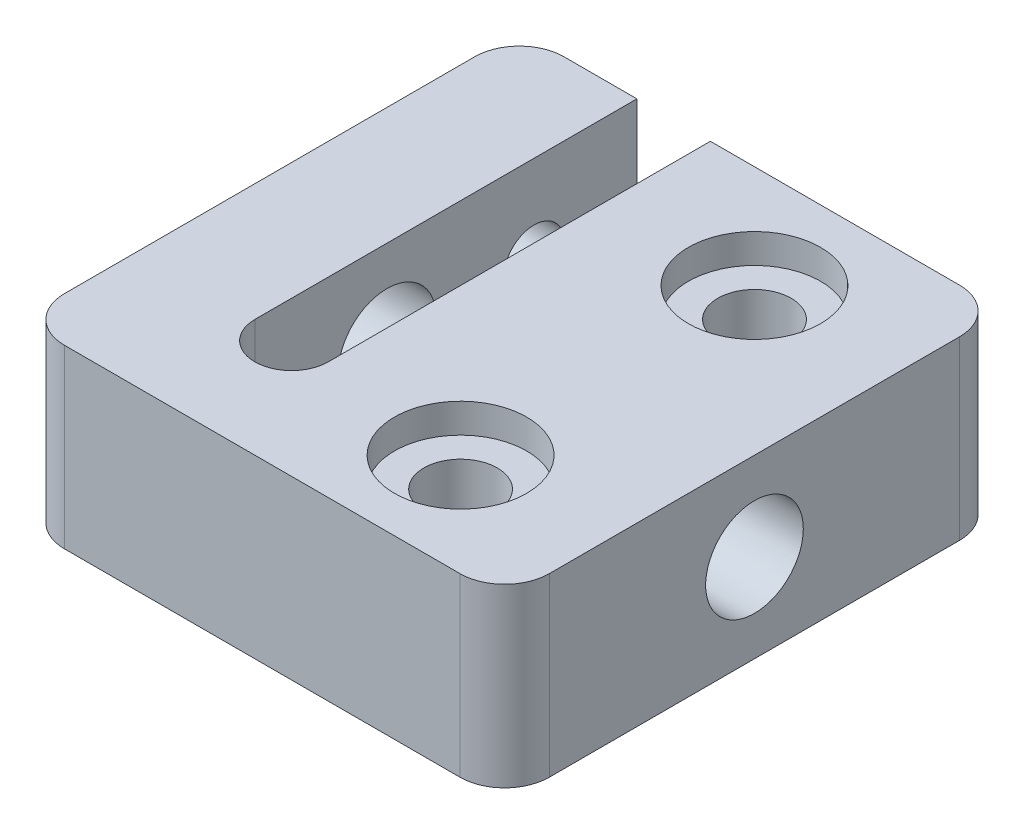
ISO-10303-21;
HEADER;
FILE_DESCRIPTION(('STEP AP214'),'2;1');
FILE_NAME('part.step','',(''),(''),'','','');
FILE_SCHEMA(('AUTOMOTIVE_DESIGN { 1 0 10303 214 1 1 1 1 }'));
ENDSEC;
DATA;
#1=APPLICATION_CONTEXT('core data for automotive mechanical design processes');
#2=APPLICATION_PROTOCOL_DEFINITION('international standard','automotive_design',2000,#1);
#3=PRODUCT_CONTEXT('',#1,'mechanical');
#4=PRODUCT('Part','Part','',(#3));
#5=PRODUCT_RELATED_PRODUCT_CATEGORY('part','',(#4));
#6=PRODUCT_DEFINITION_FORMATION('','',#4);
#7=PRODUCT_DEFINITION_CONTEXT('part definition',#1,'design');
#8=PRODUCT_DEFINITION('design','',#6,#7);
#9=PRODUCT_DEFINITION_SHAPE('','',#8);
#10=(LENGTH_UNIT() NAMED_UNIT(*) SI_UNIT(.MILLI.,.METRE.));
#11=(NAMED_UNIT(*) PLANE_ANGLE_UNIT() SI_UNIT($,.RADIAN.));
#12=(NAMED_UNIT(*) SI_UNIT($,.STERADIAN.) SOLID_ANGLE_UNIT());
#13=UNCERTAINTY_MEASURE_WITH_UNIT(LENGTH_MEASURE(1.E-05),#10,'distance_accuracy_value','');
#14=(GEOMETRIC_REPRESENTATION_CONTEXT(3) GLOBAL_UNCERTAINTY_ASSIGNED_CONTEXT((#13)) GLOBAL_UNIT_ASSIGNED_CONTEXT((#10,
#11,#12)) REPRESENTATION_CONTEXT('',''));
#15=CARTESIAN_POINT('',(0.,0.,0.));
#16=DIRECTION('',(0.,0.,1.));
#17=DIRECTION('',(1.,0.,0.));
#18=AXIS2_PLACEMENT_3D('',#15,#16,#17);
#19=CARTESIAN_POINT('',(8.80940107675852,0.,6.));
#20=DIRECTION('',(0.,0.,-1.));
#21=DIRECTION('',(-1.,0.,0.));
#22=AXIS2_PLACEMENT_3D('',#19,#20,#21);
#23=PLANE('',#22);
#24=DIRECTION('',(-1.,0.,0.));
#25=VECTOR('',#24,1.);
#26=CARTESIAN_POINT('',(3.50772533671816,0.,6.));
#27=LINE('',#26,#25);
#28=CARTESIAN_POINT('',(8.80940107675852,0.,6.));
#29=VERTEX_POINT('',#28);
#30=CARTESIAN_POINT('',(4.19059892324151,0.,6.));
#31=VERTEX_POINT('',#30);
#32=EDGE_CURVE('E35',#29,#31,#27,.T.);
#33=ORIENTED_EDGE('',*,*,#32,.F.);
#34=DIRECTION('',(0.,1.,0.));
#35=VECTOR('',#34,1.);
#36=CARTESIAN_POINT('',(8.80940107675852,0.,6.));
#37=LINE('',#36,#35);
#38=CARTESIAN_POINT('',(8.80940107675852,5.,6.));
#39=VERTEX_POINT('',#38);
#40=EDGE_CURVE('E11',#29,#39,#37,.T.);
#41=ORIENTED_EDGE('',*,*,#40,.T.);
#42=DIRECTION('',(-1.,0.,0.));
#43=VECTOR('',#42,1.);
#44=CARTESIAN_POINT('',(8.80940107675852,5.,6.));
#45=LINE('',#44,#43);
#46=CARTESIAN_POINT('',(4.19059892324151,5.,6.));
#47=VERTEX_POINT('',#46);
#48=EDGE_CURVE('E27',#39,#47,#45,.T.);
#49=ORIENTED_EDGE('',*,*,#48,.T.);
#50=DIRECTION('',(0.,1.,0.));
#51=VECTOR('',#50,1.);
#52=CARTESIAN_POINT('',(4.19059892324151,0.,6.));
#53=LINE('',#52,#51);
#54=EDGE_CURVE('E270',#31,#47,#53,.T.);
#55=ORIENTED_EDGE('',*,*,#54,.F.);
#56=EDGE_LOOP('',(#33,#41,#49,#55));
#57=FACE_BOUND('',#56,.T.);
#58=ADVANCED_FACE('F16',(#57),#23,.F.);
#59=CARTESIAN_POINT('',(11.118802153517,0.,10.));
#60=DIRECTION('',(0.866025403784439,0.,-0.5));
#61=DIRECTION('',(-0.5,0.,-0.866025403784439));
#62=AXIS2_PLACEMENT_3D('',#59,#60,#61);
#63=PLANE('',#62);
#64=DIRECTION('',(-0.5,0.,-0.866025403784439));
#65=VECTOR('',#64,1.);
#66=CARTESIAN_POINT('',(7.26546224611227,0.,3.32581950154222));
#67=LINE('',#66,#65);
#68=CARTESIAN_POINT('',(11.118802153517,0.,10.));
#69=VERTEX_POINT('',#68);
#70=EDGE_CURVE('E280',#69,#29,#67,.T.);
#71=ORIENTED_EDGE('',*,*,#70,.F.);
#72=DIRECTION('',(0.,1.,0.));
#73=VECTOR('',#72,1.);
#74=CARTESIAN_POINT('',(11.118802153517,0.,10.));
#75=LINE('',#74,#73);
#76=CARTESIAN_POINT('',(11.118802153517,5.,10.));
#77=VERTEX_POINT('',#76);
#78=EDGE_CURVE('E276',#69,#77,#75,.T.);
#79=ORIENTED_EDGE('',*,*,#78,.T.);
#80=DIRECTION('',(-0.5,0.,-0.866025403784439));
#81=VECTOR('',#80,1.);
#82=CARTESIAN_POINT('',(11.118802153517,5.,10.));
#83=LINE('',#82,#81);
#84=EDGE_CURVE('E272',#77,#39,#83,.T.);
#85=ORIENTED_EDGE('',*,*,#84,.T.);
#86=ORIENTED_EDGE('',*,*,#40,.F.);
#87=EDGE_LOOP('',(#71,#79,#85,#86));
#88=FACE_BOUND('',#87,.T.);
#89=ADVANCED_FACE('F1075',(#88),#63,.F.);
#90=CARTESIAN_POINT('',(8.80940107675851,0.,14.));
#91=DIRECTION('',(0.866025403784438,0.,0.5));
#92=DIRECTION('',(0.5,0.,-0.866025403784438));
#93=AXIS2_PLACEMENT_3D('',#90,#91,#92);
#94=PLANE('',#93);
#95=DIRECTION('',(0.5,0.,-0.866025403784438));
#96=VECTOR('',#95,1.);
#97=CARTESIAN_POINT('',(10.5892533833327,0.,10.9172053750448));
#98=LINE('',#97,#96);
#99=CARTESIAN_POINT('',(8.80940107675851,0.,14.));
#100=VERTEX_POINT('',#99);
#101=EDGE_CURVE('E284',#100,#69,#98,.T.);
#102=ORIENTED_EDGE('',*,*,#101,.F.);
#103=DIRECTION('',(0.,1.,0.));
#104=VECTOR('',#103,1.);
#105=CARTESIAN_POINT('',(8.80940107675851,0.,14.));
#106=LINE('',#105,#104);
#107=CARTESIAN_POINT('',(8.80940107675851,5.,14.));
#108=VERTEX_POINT('',#107);
#109=EDGE_CURVE('E163',#100,#108,#106,.T.);
#110=ORIENTED_EDGE('',*,*,#109,.T.);
#111=DIRECTION('',(0.5,0.,-0.866025403784438));
#112=VECTOR('',#111,1.);
#113=CARTESIAN_POINT('',(8.80940107675851,5.,14.));
#114=LINE('',#113,#112);
#115=EDGE_CURVE('E159',#108,#77,#114,.T.);
#116=ORIENTED_EDGE('',*,*,#115,.T.);
#117=ORIENTED_EDGE('',*,*,#78,.F.);
#118=EDGE_LOOP('',(#102,#110,#116,#117));
#119=FACE_BOUND('',#118,.T.);
#120=ADVANCED_FACE('F1064',(#119),#94,.F.);
#121=CARTESIAN_POINT('',(4.19059892324151,0.,14.));
#122=DIRECTION('',(0.,0.,1.));
#123=DIRECTION('',(1.,0.,0.));
#124=AXIS2_PLACEMENT_3D('',#121,#122,#123);
#125=PLANE('',#124);
#126=DIRECTION('',(1.,0.,0.));
#127=VECTOR('',#126,1.);
#128=CARTESIAN_POINT('',(1.19832425995964,0.,14.));
#129=LINE('',#128,#127);
#130=CARTESIAN_POINT('',(4.19059892324151,0.,14.));
#131=VERTEX_POINT('',#130);
#132=EDGE_CURVE('E348',#131,#100,#129,.T.);
#133=ORIENTED_EDGE('',*,*,#132,.F.);
#134=DIRECTION('',(0.,1.,0.));
#135=VECTOR('',#134,1.);
#136=CARTESIAN_POINT('',(4.19059892324151,0.,14.));
#137=LINE('',#136,#135);
#138=CARTESIAN_POINT('',(4.19059892324151,5.,14.));
#139=VERTEX_POINT('',#138);
#140=EDGE_CURVE('E164',#131,#139,#137,.T.);
#141=ORIENTED_EDGE('',*,*,#140,.T.);
#142=DIRECTION('',(1.,0.,0.));
#143=VECTOR('',#142,1.);
#144=CARTESIAN_POINT('',(4.19059892324151,5.,14.));
#145=LINE('',#144,#143);
#146=EDGE_CURVE('E264',#139,#108,#145,.T.);
#147=ORIENTED_EDGE('',*,*,#146,.T.);
#148=ORIENTED_EDGE('',*,*,#109,.F.);
#149=EDGE_LOOP('',(#133,#141,#147,#148));
#150=FACE_BOUND('',#149,.T.);
#151=ADVANCED_FACE('F1053',(#150),#125,.F.);
#152=CARTESIAN_POINT('',(1.88119784648301,0.,10.));
#153=DIRECTION('',(-0.866025403784439,0.,0.5));
#154=DIRECTION('',(0.5,0.,0.866025403784439));
#155=AXIS2_PLACEMENT_3D('',#152,#153,#154);
#156=PLANE('',#155);
#157=DIRECTION('',(0.5,0.,0.866025403784439));
#158=VECTOR('',#157,1.);
#159=CARTESIAN_POINT('',(-0.817441522542489,0.,5.32581950154222));
#160=LINE('',#159,#158);
#161=CARTESIAN_POINT('',(1.88119784648301,0.,10.));
#162=VERTEX_POINT('',#161);
#163=EDGE_CURVE('E186',#162,#131,#160,.T.);
#164=ORIENTED_EDGE('',*,*,#163,.F.);
#165=DIRECTION('',(0.,1.,0.));
#166=VECTOR('',#165,1.);
#167=CARTESIAN_POINT('',(1.88119784648301,0.,10.));
#168=LINE('',#167,#166);
#169=CARTESIAN_POINT('',(1.88119784648301,5.,10.));
#170=VERTEX_POINT('',#169);
#171=EDGE_CURVE('E260',#162,#170,#168,.T.);
#172=ORIENTED_EDGE('',*,*,#171,.T.);
#173=DIRECTION('',(0.5,0.,0.866025403784439));
#174=VECTOR('',#173,1.);
#175=CARTESIAN_POINT('',(1.88119784648301,5.,10.));
#176=LINE('',#175,#174);
#177=EDGE_CURVE('E265',#170,#139,#176,.T.);
#178=ORIENTED_EDGE('',*,*,#177,.T.);
#179=ORIENTED_EDGE('',*,*,#140,.F.);
#180=EDGE_LOOP('',(#164,#172,#178,#179));
#181=FACE_BOUND('',#180,.T.);
#182=ADVANCED_FACE('F1042',(#181),#156,.F.);
#183=CARTESIAN_POINT('',(4.19059892324151,0.,6.));
#184=DIRECTION('',(-0.866025403784438,0.,-0.5));
#185=DIRECTION('',(-0.5,0.,0.866025403784438));
#186=AXIS2_PLACEMENT_3D('',#183,#184,#185);
#187=PLANE('',#186);
#188=DIRECTION('',(-0.5,0.,0.866025403784438));
#189=VECTOR('',#188,1.);
#190=CARTESIAN_POINT('',(4.81575069143646,0.,4.91720537504484));
#191=LINE('',#190,#189);
#192=EDGE_CURVE('E182',#31,#162,#191,.T.);
#193=ORIENTED_EDGE('',*,*,#192,.F.);
#194=ORIENTED_EDGE('',*,*,#54,.T.);
#195=DIRECTION('',(-0.5,0.,0.866025403784438));
#196=VECTOR('',#195,1.);
#197=CARTESIAN_POINT('',(4.19059892324151,5.,6.));
#198=LINE('',#197,#196);
#199=EDGE_CURVE('E266',#47,#170,#198,.T.);
#200=ORIENTED_EDGE('',*,*,#199,.T.);
#201=ORIENTED_EDGE('',*,*,#171,.F.);
#202=EDGE_LOOP('',(#193,#194,#200,#201));
#203=FACE_BOUND('',#202,.T.);
#204=ADVANCED_FACE('F1032',(#203),#187,.F.);
#205=CARTESIAN_POINT('',(6.5,5.,10.));
#206=DIRECTION('',(0.,1.,0.));
#207=DIRECTION('',(0.,0.,1.));
#208=AXIS2_PLACEMENT_3D('',#205,#206,#207);
#209=PLANE('',#208);
#210=CARTESIAN_POINT('',(6.5,5.,10.));
#211=DIRECTION('',(0.,-1.,0.));
#212=DIRECTION('',(1.,0.,0.));
#213=AXIS2_PLACEMENT_3D('',#210,#211,#212);
#214=CIRCLE('',#213,2.5);
#215=CARTESIAN_POINT('',(9.,5.,10.));
#216=VERTEX_POINT('',#215);
#217=EDGE_CURVE('E197',#216,#216,#214,.T.);
#218=ORIENTED_EDGE('',*,*,#217,.F.);
#219=EDGE_LOOP('',(#218));
#220=FACE_BOUND('',#219,.T.);
#221=ORIENTED_EDGE('',*,*,#199,.F.);
#222=ORIENTED_EDGE('',*,*,#48,.F.);
#223=ORIENTED_EDGE('',*,*,#84,.F.);
#224=ORIENTED_EDGE('',*,*,#115,.F.);
#225=ORIENTED_EDGE('',*,*,#146,.F.);
#226=ORIENTED_EDGE('',*,*,#177,.F.);
#227=EDGE_LOOP('',(#221,#222,#223,#224,#225,#226));
#228=FACE_BOUND('',#227,.T.);
#229=ADVANCED_FACE('F1022',(#220,#228),#209,.F.);
#230=CARTESIAN_POINT('',(4.19059892324151,0.,-6.));
#231=DIRECTION('',(0.,0.,1.));
#232=DIRECTION('',(1.,0.,0.));
#233=AXIS2_PLACEMENT_3D('',#230,#231,#232);
#234=PLANE('',#233);
#235=DIRECTION('',(1.,0.,0.));
#236=VECTOR('',#235,1.);
#237=CARTESIAN_POINT('',(1.19832425995965,0.,-6.));
#238=LINE('',#237,#236);
#239=CARTESIAN_POINT('',(4.19059892324151,0.,-6.));
#240=VERTEX_POINT('',#239);
#241=CARTESIAN_POINT('',(8.80940107675851,0.,-6.));
#242=VERTEX_POINT('',#241);
#243=EDGE_CURVE('E285',#240,#242,#238,.T.);
#244=ORIENTED_EDGE('',*,*,#243,.F.);
#245=DIRECTION('',(0.,1.,0.));
#246=VECTOR('',#245,1.);
#247=CARTESIAN_POINT('',(4.19059892324151,0.,-6.));
#248=LINE('',#247,#246);
#249=CARTESIAN_POINT('',(4.19059892324151,5.,-6.));
#250=VERTEX_POINT('',#249);
#251=EDGE_CURVE('E271',#240,#250,#248,.T.);
#252=ORIENTED_EDGE('',*,*,#251,.T.);
#253=DIRECTION('',(1.,0.,0.));
#254=VECTOR('',#253,1.);
#255=CARTESIAN_POINT('',(4.19059892324151,5.,-6.));
#256=LINE('',#255,#254);
#257=CARTESIAN_POINT('',(8.80940107675851,5.,-6.));
#258=VERTEX_POINT('',#257);
#259=EDGE_CURVE('E233',#250,#258,#256,.T.);
#260=ORIENTED_EDGE('',*,*,#259,.T.);
#261=DIRECTION('',(0.,1.,0.));
#262=VECTOR('',#261,1.);
#263=CARTESIAN_POINT('',(8.80940107675851,0.,-6.));
#264=LINE('',#263,#262);
#265=EDGE_CURVE('E244',#242,#258,#264,.T.);
#266=ORIENTED_EDGE('',*,*,#265,.F.);
#267=EDGE_LOOP('',(#244,#252,#260,#266));
#268=FACE_BOUND('',#267,.T.);
#269=ADVANCED_FACE('F1011',(#268),#234,.F.);
#270=CARTESIAN_POINT('',(1.88119784648301,0.,-10.));
#271=DIRECTION('',(-0.86602540378444,0.,0.5));
#272=DIRECTION('',(0.5,0.,0.86602540378444));
#273=AXIS2_PLACEMENT_3D('',#270,#271,#272);
#274=PLANE('',#273);
#275=DIRECTION('',(0.5,0.,0.86602540378444));
#276=VECTOR('',#275,1.);
#277=CARTESIAN_POINT('',(3.5126854963797,0.,-7.17418049845778));
#278=LINE('',#277,#276);
#279=CARTESIAN_POINT('',(1.88119784648301,0.,-10.));
#280=VERTEX_POINT('',#279);
#281=EDGE_CURVE('E398',#280,#240,#278,.T.);
#282=ORIENTED_EDGE('',*,*,#281,.F.);
#283=DIRECTION('',(0.,1.,0.));
#284=VECTOR('',#283,1.);
#285=CARTESIAN_POINT('',(1.88119784648301,0.,-10.));
#286=LINE('',#285,#284);
#287=CARTESIAN_POINT('',(1.88119784648301,5.,-10.));
#288=VERTEX_POINT('',#287);
#289=EDGE_CURVE('E229',#280,#288,#286,.T.);
#290=ORIENTED_EDGE('',*,*,#289,.T.);
#291=DIRECTION('',(0.5,0.,0.86602540378444));
#292=VECTOR('',#291,1.);
#293=CARTESIAN_POINT('',(1.88119784648301,5.,-10.));
#294=LINE('',#293,#292);
#295=EDGE_CURVE('E203',#288,#250,#294,.T.);
#296=ORIENTED_EDGE('',*,*,#295,.T.);
#297=ORIENTED_EDGE('',*,*,#251,.F.);
#298=EDGE_LOOP('',(#282,#290,#296,#297));
#299=FACE_BOUND('',#298,.T.);
#300=ADVANCED_FACE('F1000',(#299),#274,.F.);
#301=CARTESIAN_POINT('',(4.19059892324152,0.,-14.));
#302=DIRECTION('',(-0.866025403784438,0.,-0.5));
#303=DIRECTION('',(-0.5,0.,0.866025403784438));
#304=AXIS2_PLACEMENT_3D('',#301,#302,#303);
#305=PLANE('',#304);
#306=DIRECTION('',(-0.5,0.,0.866025403784438));
#307=VECTOR('',#306,1.);
#308=CARTESIAN_POINT('',(0.485623672514256,0.,-7.58279462495518));
#309=LINE('',#308,#307);
#310=CARTESIAN_POINT('',(4.19059892324152,0.,-14.));
#311=VERTEX_POINT('',#310);
#312=EDGE_CURVE('E259',#311,#280,#309,.T.);
#313=ORIENTED_EDGE('',*,*,#312,.F.);
#314=DIRECTION('',(0.,1.,0.));
#315=VECTOR('',#314,1.);
#316=CARTESIAN_POINT('',(4.19059892324152,0.,-14.));
#317=LINE('',#316,#315);
#318=CARTESIAN_POINT('',(4.19059892324152,5.,-14.));
#319=VERTEX_POINT('',#318);
#320=EDGE_CURVE('E199',#311,#319,#317,.T.);
#321=ORIENTED_EDGE('',*,*,#320,.T.);
#322=DIRECTION('',(-0.5,0.,0.866025403784438));
#323=VECTOR('',#322,1.);
#324=CARTESIAN_POINT('',(4.19059892324152,5.,-14.));
#325=LINE('',#324,#323);
#326=EDGE_CURVE('E204',#319,#288,#325,.T.);
#327=ORIENTED_EDGE('',*,*,#326,.T.);
#328=ORIENTED_EDGE('',*,*,#289,.F.);
#329=EDGE_LOOP('',(#313,#321,#327,#328));
#330=FACE_BOUND('',#329,.T.);
#331=ADVANCED_FACE('F989',(#330),#305,.F.);
#332=CARTESIAN_POINT('',(8.80940107675852,0.,-14.));
#333=DIRECTION('',(0.,0.,-1.));
#334=DIRECTION('',(-1.,0.,0.));
#335=AXIS2_PLACEMENT_3D('',#332,#333,#334);
#336=PLANE('',#335);
#337=DIRECTION('',(-1.,0.,0.));
#338=VECTOR('',#337,1.);
#339=CARTESIAN_POINT('',(3.50772533671818,0.,-14.));
#340=LINE('',#339,#338);
#341=CARTESIAN_POINT('',(8.80940107675852,0.,-14.));
#342=VERTEX_POINT('',#341);
#343=EDGE_CURVE('E181',#342,#311,#340,.T.);
#344=ORIENTED_EDGE('',*,*,#343,.F.);
#345=DIRECTION('',(0.,1.,0.));
#346=VECTOR('',#345,1.);
#347=CARTESIAN_POINT('',(8.80940107675852,0.,-14.));
#348=LINE('',#347,#346);
#349=CARTESIAN_POINT('',(8.80940107675852,5.,-14.));
#350=VERTEX_POINT('',#349);
#351=EDGE_CURVE('E20',#342,#350,#348,.T.);
#352=ORIENTED_EDGE('',*,*,#351,.T.);
#353=DIRECTION('',(-1.,0.,0.));
#354=VECTOR('',#353,1.);
#355=CARTESIAN_POINT('',(8.80940107675852,5.,-14.));
#356=LINE('',#355,#354);
#357=EDGE_CURVE('E375',#350,#319,#356,.T.);
#358=ORIENTED_EDGE('',*,*,#357,.T.);
#359=ORIENTED_EDGE('',*,*,#320,.F.);
#360=EDGE_LOOP('',(#344,#352,#358,#359));
#361=FACE_BOUND('',#360,.T.);
#362=ADVANCED_FACE('F977',(#361),#336,.F.);
#363=CARTESIAN_POINT('',(11.118802153517,0.,-10.));
#364=DIRECTION('',(0.86602540378444,0.,-0.5));
#365=DIRECTION('',(-0.5,0.,-0.86602540378444));
#366=AXIS2_PLACEMENT_3D('',#363,#364,#365);
#367=PLANE('',#366);
#368=DIRECTION('',(-0.5,0.,-0.86602540378444));
#369=VECTOR('',#368,1.);
#370=CARTESIAN_POINT('',(11.5955892650345,0.,-9.17418049845776));
#371=LINE('',#370,#369);
#372=CARTESIAN_POINT('',(11.118802153517,0.,-10.));
#373=VERTEX_POINT('',#372);
#374=EDGE_CURVE('E176',#373,#342,#371,.T.);
#375=ORIENTED_EDGE('',*,*,#374,.F.);
#376=DIRECTION('',(0.,1.,0.));
#377=VECTOR('',#376,1.);
#378=CARTESIAN_POINT('',(11.118802153517,0.,-10.));
#379=LINE('',#378,#377);
#380=CARTESIAN_POINT('',(11.118802153517,5.,-10.));
#381=VERTEX_POINT('',#380);
#382=EDGE_CURVE('E243',#373,#381,#379,.T.);
#383=ORIENTED_EDGE('',*,*,#382,.T.);
#384=DIRECTION('',(-0.5,0.,-0.86602540378444));
#385=VECTOR('',#384,1.);
#386=CARTESIAN_POINT('',(11.118802153517,5.,-10.));
#387=LINE('',#386,#385);
#388=EDGE_CURVE('E239',#381,#350,#387,.T.);
#389=ORIENTED_EDGE('',*,*,#388,.T.);
#390=ORIENTED_EDGE('',*,*,#351,.F.);
#391=EDGE_LOOP('',(#375,#383,#389,#390));
#392=FACE_BOUND('',#391,.T.);
#393=ADVANCED_FACE('F967',(#392),#367,.F.);
#394=CARTESIAN_POINT('',(8.80940107675851,0.,-6.));
#395=DIRECTION('',(0.866025403784438,0.,0.5));
#396=DIRECTION('',(0.5,0.,-0.866025403784438));
#397=AXIS2_PLACEMENT_3D('',#394,#395,#396);
#398=PLANE('',#397);
#399=DIRECTION('',(0.5,0.,-0.866025403784438));
#400=VECTOR('',#399,1.);
#401=CARTESIAN_POINT('',(6.2591263644105,0.,-1.58279462495516));
#402=LINE('',#401,#400);
#403=EDGE_CURVE('E180',#242,#373,#402,.T.);
#404=ORIENTED_EDGE('',*,*,#403,.F.);
#405=ORIENTED_EDGE('',*,*,#265,.T.);
#406=DIRECTION('',(0.5,0.,-0.866025403784438));
#407=VECTOR('',#406,1.);
#408=CARTESIAN_POINT('',(8.80940107675851,5.,-6.));
#409=LINE('',#408,#407);
#410=EDGE_CURVE('E131',#258,#381,#409,.T.);
#411=ORIENTED_EDGE('',*,*,#410,.T.);
#412=ORIENTED_EDGE('',*,*,#382,.F.);
#413=EDGE_LOOP('',(#404,#405,#411,#412));
#414=FACE_BOUND('',#413,.T.);
#415=ADVANCED_FACE('F18',(#414),#398,.F.);
#416=CARTESIAN_POINT('',(6.5,5.,-10.));
#417=DIRECTION('',(0.,1.,0.));
#418=DIRECTION('',(0.,0.,1.));
#419=AXIS2_PLACEMENT_3D('',#416,#417,#418);
#420=PLANE('',#419);
#421=CARTESIAN_POINT('',(6.5,5.,-10.));
#422=DIRECTION('',(0.,-1.,0.));
#423=DIRECTION('',(1.,0.,0.));
#424=AXIS2_PLACEMENT_3D('',#421,#422,#423);
#425=CIRCLE('',#424,2.5);
#426=CARTESIAN_POINT('',(9.,5.,-10.));
#427=VERTEX_POINT('',#426);
#428=EDGE_CURVE('E124',#427,#427,#425,.T.);
#429=ORIENTED_EDGE('',*,*,#428,.F.);
#430=EDGE_LOOP('',(#429));
#431=FACE_BOUND('',#430,.T.);
#432=ORIENTED_EDGE('',*,*,#410,.F.);
#433=ORIENTED_EDGE('',*,*,#259,.F.);
#434=ORIENTED_EDGE('',*,*,#295,.F.);
#435=ORIENTED_EDGE('',*,*,#326,.F.);
#436=ORIENTED_EDGE('',*,*,#357,.F.);
#437=ORIENTED_EDGE('',*,*,#388,.F.);
#438=EDGE_LOOP('',(#432,#433,#434,#435,#436,#437));
#439=FACE_BOUND('',#438,.T.);
#440=ADVANCED_FACE('F945',(#431,#439),#420,.F.);
#441=CARTESIAN_POINT('',(6.5,12.,-10.));
#442=DIRECTION('',(0.,1.,0.));
#443=DIRECTION('',(-1.,0.,0.));
#444=AXIS2_PLACEMENT_3D('',#441,#442,#443);
#445=CYLINDRICAL_SURFACE('',#444,4.5);
#446=CARTESIAN_POINT('',(6.5,10.,-10.));
#447=DIRECTION('',(0.,-1.,0.));
#448=DIRECTION('',(-1.,0.,0.));
#449=AXIS2_PLACEMENT_3D('',#446,#447,#448);
#450=CIRCLE('',#449,4.5);
#451=CARTESIAN_POINT('',(11.,10.,-10.));
#452=VERTEX_POINT('',#451);
#453=EDGE_CURVE('E123',#452,#452,#450,.T.);
#454=ORIENTED_EDGE('',*,*,#453,.T.);
#455=EDGE_LOOP('',(#454));
#456=FACE_BOUND('',#455,.T.);
#457=CARTESIAN_POINT('',(6.5,12.,-10.));
#458=DIRECTION('',(0.,-1.,0.));
#459=DIRECTION('',(-1.,0.,0.));
#460=AXIS2_PLACEMENT_3D('',#457,#458,#459);
#461=CIRCLE('',#460,4.5);
#462=CARTESIAN_POINT('',(11.,12.,-10.));
#463=VERTEX_POINT('',#462);
#464=EDGE_CURVE('E237',#463,#463,#461,.T.);
#465=ORIENTED_EDGE('',*,*,#464,.F.);
#466=EDGE_LOOP('',(#465));
#467=FACE_BOUND('',#466,.T.);
#468=ADVANCED_FACE('F934',(#456,#467),#445,.F.);
#469=CARTESIAN_POINT('',(6.5,10.,-10.));
#470=DIRECTION('',(0.,-1.,0.));
#471=DIRECTION('',(0.,0.,-1.));
#472=AXIS2_PLACEMENT_3D('',#469,#470,#471);
#473=PLANE('',#472);
#474=CARTESIAN_POINT('',(6.5,10.,-10.));
#475=DIRECTION('',(0.,1.,0.));
#476=DIRECTION('',(1.,0.,0.));
#477=AXIS2_PLACEMENT_3D('',#474,#475,#476);
#478=CIRCLE('',#477,2.5);
#479=CARTESIAN_POINT('',(9.,10.,-10.));
#480=VERTEX_POINT('',#479);
#481=EDGE_CURVE('E135',#480,#480,#478,.T.);
#482=ORIENTED_EDGE('',*,*,#481,.F.);
#483=EDGE_LOOP('',(#482));
#484=FACE_BOUND('',#483,.T.);
#485=ORIENTED_EDGE('',*,*,#453,.F.);
#486=EDGE_LOOP('',(#485));
#487=FACE_BOUND('',#486,.T.);
#488=ADVANCED_FACE('F924',(#484,#487),#473,.F.);
#489=CARTESIAN_POINT('',(6.5,12.,10.));
#490=DIRECTION('',(0.,1.,0.));
#491=DIRECTION('',(-1.,0.,0.));
#492=AXIS2_PLACEMENT_3D('',#489,#490,#491);
#493=CYLINDRICAL_SURFACE('',#492,4.5);
#494=CARTESIAN_POINT('',(6.5,10.,10.));
#495=DIRECTION('',(0.,-1.,0.));
#496=DIRECTION('',(-1.,0.,0.));
#497=AXIS2_PLACEMENT_3D('',#494,#495,#496);
#498=CIRCLE('',#497,4.5);
#499=CARTESIAN_POINT('',(11.,10.,10.));
#500=VERTEX_POINT('',#499);
#501=EDGE_CURVE('E119',#500,#500,#498,.T.);
#502=ORIENTED_EDGE('',*,*,#501,.T.);
#503=EDGE_LOOP('',(#502));
#504=FACE_BOUND('',#503,.T.);
#505=CARTESIAN_POINT('',(6.5,12.,10.));
#506=DIRECTION('',(0.,-1.,0.));
#507=DIRECTION('',(-1.,0.,0.));
#508=AXIS2_PLACEMENT_3D('',#505,#506,#507);
#509=CIRCLE('',#508,4.5);
#510=CARTESIAN_POINT('',(11.,12.,10.));
#511=VERTEX_POINT('',#510);
#512=EDGE_CURVE('E234',#511,#511,#509,.T.);
#513=ORIENTED_EDGE('',*,*,#512,.F.);
#514=EDGE_LOOP('',(#513));
#515=FACE_BOUND('',#514,.T.);
#516=ADVANCED_FACE('F912',(#504,#515),#493,.F.);
#517=CARTESIAN_POINT('',(6.5,10.,10.));
#518=DIRECTION('',(0.,-1.,0.));
#519=DIRECTION('',(0.,0.,-1.));
#520=AXIS2_PLACEMENT_3D('',#517,#518,#519);
#521=PLANE('',#520);
#522=CARTESIAN_POINT('',(6.5,10.,10.));
#523=DIRECTION('',(0.,1.,0.));
#524=DIRECTION('',(1.,0.,0.));
#525=AXIS2_PLACEMENT_3D('',#522,#523,#524);
#526=CIRCLE('',#525,2.5);
#527=CARTESIAN_POINT('',(9.,10.,10.));
#528=VERTEX_POINT('',#527);
#529=EDGE_CURVE('E193',#528,#528,#526,.T.);
#530=ORIENTED_EDGE('',*,*,#529,.F.);
#531=EDGE_LOOP('',(#530));
#532=FACE_BOUND('',#531,.T.);
#533=ORIENTED_EDGE('',*,*,#501,.F.);
#534=EDGE_LOOP('',(#533));
#535=FACE_BOUND('',#534,.T.);
#536=ADVANCED_FACE('F120',(#532,#535),#521,.F.);
#537=CARTESIAN_POINT('',(-11.5,6.,-10.));
#538=DIRECTION('',(1.,0.,0.));
#539=DIRECTION('',(0.,0.,1.));
#540=AXIS2_PLACEMENT_3D('',#537,#538,#539);
#541=CYLINDRICAL_SURFACE('',#540,2.067);
#542=CARTESIAN_POINT('',(-8.5,6.,-10.));
#543=DIRECTION('',(-1.,0.,0.));
#544=DIRECTION('',(0.,0.,1.));
#545=AXIS2_PLACEMENT_3D('',#542,#543,#544);
#546=CIRCLE('',#545,2.067);
#547=CARTESIAN_POINT('',(-8.5,6.,-12.067));
#548=VERTEX_POINT('',#547);
#549=EDGE_CURVE('E141',#548,#548,#546,.T.);
#550=ORIENTED_EDGE('',*,*,#549,.F.);
#551=EDGE_LOOP('',(#550));
#552=FACE_BOUND('',#551,.T.);
#553=CARTESIAN_POINT('',(-16.5,6.,-10.));
#554=DIRECTION('',(1.,0.,0.));
#555=DIRECTION('',(0.,0.,1.));
#556=AXIS2_PLACEMENT_3D('',#553,#554,#555);
#557=CIRCLE('',#556,2.067);
#558=CARTESIAN_POINT('',(-16.5,6.,-7.933));
#559=VERTEX_POINT('',#558);
#560=EDGE_CURVE('E157',#559,#559,#557,.T.);
#561=ORIENTED_EDGE('',*,*,#560,.F.);
#562=EDGE_LOOP('',(#561));
#563=FACE_BOUND('',#562,.T.);
#564=ADVANCED_FACE('F888',(#552,#563),#541,.F.);
#565=CARTESIAN_POINT('',(3.5,6.,0.));
#566=DIRECTION('',(1.,0.,0.));
#567=DIRECTION('',(0.,0.,1.));
#568=AXIS2_PLACEMENT_3D('',#565,#566,#567);
#569=CYLINDRICAL_SURFACE('',#568,3.3235);
#570=CARTESIAN_POINT('',(-16.5,6.,0.));
#571=DIRECTION('',(1.,0.,0.));
#572=DIRECTION('',(0.,0.,1.));
#573=AXIS2_PLACEMENT_3D('',#570,#571,#572);
#574=CIRCLE('',#573,3.3235);
#575=CARTESIAN_POINT('',(-16.5,6.,3.3235));
#576=VERTEX_POINT('',#575);
#577=EDGE_CURVE('E153',#576,#576,#574,.T.);
#578=ORIENTED_EDGE('',*,*,#577,.F.);
#579=EDGE_LOOP('',(#578));
#580=FACE_BOUND('',#579,.T.);
#581=CARTESIAN_POINT('',(-8.5,6.,0.));
#582=DIRECTION('',(-1.,0.,0.));
#583=DIRECTION('',(0.,0.,1.));
#584=AXIS2_PLACEMENT_3D('',#581,#582,#583);
#585=CIRCLE('',#584,3.3235);
#586=CARTESIAN_POINT('',(-8.5,6.,-3.3235));
#587=VERTEX_POINT('',#586);
#588=EDGE_CURVE('E146',#587,#587,#585,.T.);
#589=ORIENTED_EDGE('',*,*,#588,.F.);
#590=EDGE_LOOP('',(#589));
#591=FACE_BOUND('',#590,.T.);
#592=ADVANCED_FACE('F877',(#580,#591),#569,.F.);
#593=CARTESIAN_POINT('',(3.5,6.,0.));
#594=DIRECTION('',(1.,0.,0.));
#595=DIRECTION('',(0.,0.,1.));
#596=AXIS2_PLACEMENT_3D('',#593,#594,#595);
#597=CYLINDRICAL_SURFACE('',#596,3.3235);
#598=CARTESIAN_POINT('',(-3.5,6.,0.));
#599=DIRECTION('',(1.,0.,0.));
#600=DIRECTION('',(0.,0.,1.));
#601=AXIS2_PLACEMENT_3D('',#598,#599,#600);
#602=CIRCLE('',#601,3.3235);
#603=CARTESIAN_POINT('',(-3.5,6.,-3.3235));
#604=VERTEX_POINT('',#603);
#605=EDGE_CURVE('E251',#604,#604,#602,.T.);
#606=ORIENTED_EDGE('',*,*,#605,.F.);
#607=EDGE_LOOP('',(#606));
#608=FACE_BOUND('',#607,.T.);
#609=CARTESIAN_POINT('',(16.5,6.,0.));
#610=DIRECTION('',(-1.,0.,0.));
#611=DIRECTION('',(0.,0.,1.));
#612=AXIS2_PLACEMENT_3D('',#609,#610,#611);
#613=CIRCLE('',#612,3.3235);
#614=CARTESIAN_POINT('',(16.5,6.,-3.3235));
#615=VERTEX_POINT('',#614);
#616=EDGE_CURVE('E165',#615,#615,#613,.T.);
#617=ORIENTED_EDGE('',*,*,#616,.F.);
#618=EDGE_LOOP('',(#617));
#619=FACE_BOUND('',#618,.T.);
#620=ADVANCED_FACE('F866',(#608,#619),#597,.F.);
#621=CARTESIAN_POINT('',(6.5,0.,-10.));
#622=DIRECTION('',(0.,-1.,0.));
#623=DIRECTION('',(1.,0.,0.));
#624=AXIS2_PLACEMENT_3D('',#621,#622,#623);
#625=CYLINDRICAL_SURFACE('',#624,2.5);
#626=ORIENTED_EDGE('',*,*,#428,.T.);
#627=EDGE_LOOP('',(#626));
#628=FACE_BOUND('',#627,.T.);
#629=ORIENTED_EDGE('',*,*,#481,.T.);
#630=EDGE_LOOP('',(#629));
#631=FACE_BOUND('',#630,.T.);
#632=ADVANCED_FACE('F854',(#628,#631),#625,.F.);
#633=CARTESIAN_POINT('',(6.5,0.,10.));
#634=DIRECTION('',(0.,-1.,0.));
#635=DIRECTION('',(1.,0.,0.));
#636=AXIS2_PLACEMENT_3D('',#633,#634,#635);
#637=CYLINDRICAL_SURFACE('',#636,2.5);
#638=ORIENTED_EDGE('',*,*,#217,.T.);
#639=EDGE_LOOP('',(#638));
#640=FACE_BOUND('',#639,.T.);
#641=ORIENTED_EDGE('',*,*,#529,.T.);
#642=EDGE_LOOP('',(#641));
#643=FACE_BOUND('',#642,.T.);
#644=ADVANCED_FACE('F844',(#640,#643),#637,.F.);
#645=CARTESIAN_POINT('',(-6.,0.,9.));
#646=DIRECTION('',(0.,-1.,0.));
#647=DIRECTION('',(1.,0.,0.));
#648=AXIS2_PLACEMENT_3D('',#645,#646,#647);
#649=CYLINDRICAL_SURFACE('',#648,2.5);
#650=CARTESIAN_POINT('',(-6.,0.,9.));
#651=DIRECTION('',(0.,-1.,0.));
#652=DIRECTION('',(1.,0.,0.));
#653=AXIS2_PLACEMENT_3D('',#650,#651,#652);
#654=CIRCLE('',#653,2.5);
#655=CARTESIAN_POINT('',(-3.5,0.,9.));
#656=VERTEX_POINT('',#655);
#657=CARTESIAN_POINT('',(-8.5,0.,9.));
#658=VERTEX_POINT('',#657);
#659=EDGE_CURVE('E198',#656,#658,#654,.T.);
#660=ORIENTED_EDGE('',*,*,#659,.T.);
#661=DIRECTION('',(0.,1.,0.));
#662=VECTOR('',#661,1.);
#663=CARTESIAN_POINT('',(-8.5,0.,9.));
#664=LINE('',#663,#662);
#665=CARTESIAN_POINT('',(-8.5,12.,9.));
#666=VERTEX_POINT('',#665);
#667=EDGE_CURVE('E139',#658,#666,#664,.T.);
#668=ORIENTED_EDGE('',*,*,#667,.T.);
#669=CARTESIAN_POINT('',(-6.,12.,9.));
#670=DIRECTION('',(0.,-1.,0.));
#671=DIRECTION('',(1.,0.,0.));
#672=AXIS2_PLACEMENT_3D('',#669,#670,#671);
#673=CIRCLE('',#672,2.5);
#674=CARTESIAN_POINT('',(-3.5,12.,9.));
#675=VERTEX_POINT('',#674);
#676=EDGE_CURVE('E247',#675,#666,#673,.T.);
#677=ORIENTED_EDGE('',*,*,#676,.F.);
#678=DIRECTION('',(0.,1.,0.));
#679=VECTOR('',#678,1.);
#680=CARTESIAN_POINT('',(-3.5,0.,9.));
#681=LINE('',#680,#679);
#682=EDGE_CURVE('E191',#656,#675,#681,.T.);
#683=ORIENTED_EDGE('',*,*,#682,.F.);
#684=EDGE_LOOP('',(#660,#668,#677,#683));
#685=FACE_BOUND('',#684,.T.);
#686=ADVANCED_FACE('F520',(#685),#649,.F.);
#687=CARTESIAN_POINT('',(-3.5,0.,-17.));
#688=DIRECTION('',(-1.,0.,0.));
#689=DIRECTION('',(0.,0.,1.));
#690=AXIS2_PLACEMENT_3D('',#687,#688,#689);
#691=PLANE('',#690);
#692=ORIENTED_EDGE('',*,*,#605,.T.);
#693=EDGE_LOOP('',(#692));
#694=FACE_BOUND('',#693,.T.);
#695=DIRECTION('',(0.,0.,1.));
#696=VECTOR('',#695,1.);
#697=CARTESIAN_POINT('',(-3.5,0.,-17.));
#698=LINE('',#697,#696);
#699=CARTESIAN_POINT('',(-3.5,0.,-17.));
#700=VERTEX_POINT('',#699);
#701=EDGE_CURVE('E208',#700,#656,#698,.T.);
#702=ORIENTED_EDGE('',*,*,#701,.T.);
#703=ORIENTED_EDGE('',*,*,#682,.T.);
#704=DIRECTION('',(0.,0.,1.));
#705=VECTOR('',#704,1.);
#706=CARTESIAN_POINT('',(-3.5,12.,-17.));
#707=LINE('',#706,#705);
#708=CARTESIAN_POINT('',(-3.5,12.,-17.));
#709=VERTEX_POINT('',#708);
#710=EDGE_CURVE('E252',#709,#675,#707,.T.);
#711=ORIENTED_EDGE('',*,*,#710,.F.);
#712=DIRECTION('',(0.,1.,0.));
#713=VECTOR('',#712,1.);
#714=CARTESIAN_POINT('',(-3.5,0.,-17.));
#715=LINE('',#714,#713);
#716=EDGE_CURVE('E192',#700,#709,#715,.T.);
#717=ORIENTED_EDGE('',*,*,#716,.F.);
#718=EDGE_LOOP('',(#702,#703,#711,#717));
#719=FACE_BOUND('',#718,.T.);
#720=ADVANCED_FACE('F820',(#694,#719),#691,.T.);
#721=CARTESIAN_POINT('',(13.46,0.,-17.));
#722=DIRECTION('',(0.,0.,-1.));
#723=DIRECTION('',(-1.,0.,0.));
#724=AXIS2_PLACEMENT_3D('',#721,#722,#723);
#725=PLANE('',#724);
#726=DIRECTION('',(-1.,0.,0.));
#727=VECTOR('',#726,1.);
#728=CARTESIAN_POINT('',(13.46,0.,-17.));
#729=LINE('',#728,#727);
#730=CARTESIAN_POINT('',(13.46,0.,-17.));
#731=VERTEX_POINT('',#730);
#732=EDGE_CURVE('E187',#731,#700,#729,.T.);
#733=ORIENTED_EDGE('',*,*,#732,.T.);
#734=ORIENTED_EDGE('',*,*,#716,.T.);
#735=DIRECTION('',(-1.,0.,0.));
#736=VECTOR('',#735,1.);
#737=CARTESIAN_POINT('',(13.46,12.,-17.));
#738=LINE('',#737,#736);
#739=CARTESIAN_POINT('',(13.46,12.,-17.));
#740=VERTEX_POINT('',#739);
#741=EDGE_CURVE('E218',#740,#709,#738,.T.);
#742=ORIENTED_EDGE('',*,*,#741,.F.);
#743=DIRECTION('',(0.,1.,0.));
#744=VECTOR('',#743,1.);
#745=CARTESIAN_POINT('',(13.46,0.,-17.));
#746=LINE('',#745,#744);
#747=EDGE_CURVE('E169',#731,#740,#746,.T.);
#748=ORIENTED_EDGE('',*,*,#747,.F.);
#749=EDGE_LOOP('',(#733,#734,#742,#748));
#750=FACE_BOUND('',#749,.T.);
#751=ADVANCED_FACE('F807',(#750),#725,.T.);
#752=CARTESIAN_POINT('',(13.46,0.,-13.96));
#753=DIRECTION('',(0.,-1.,0.));
#754=DIRECTION('',(1.,0.,0.));
#755=AXIS2_PLACEMENT_3D('',#752,#753,#754);
#756=CYLINDRICAL_SURFACE('',#755,3.04);
#757=CARTESIAN_POINT('',(13.46,0.,-13.96));
#758=DIRECTION('',(0.,1.,0.));
#759=DIRECTION('',(1.,0.,0.));
#760=AXIS2_PLACEMENT_3D('',#757,#758,#759);
#761=CIRCLE('',#760,3.04);
#762=CARTESIAN_POINT('',(16.5,0.,-13.96));
#763=VERTEX_POINT('',#762);
#764=EDGE_CURVE('E212',#763,#731,#761,.T.);
#765=ORIENTED_EDGE('',*,*,#764,.T.);
#766=ORIENTED_EDGE('',*,*,#747,.T.);
#767=CARTESIAN_POINT('',(13.46,12.,-13.96));
#768=DIRECTION('',(0.,1.,0.));
#769=DIRECTION('',(1.,0.,0.));
#770=AXIS2_PLACEMENT_3D('',#767,#768,#769);
#771=CIRCLE('',#770,3.04);
#772=CARTESIAN_POINT('',(16.5,12.,-13.96));
#773=VERTEX_POINT('',#772);
#774=EDGE_CURVE('E213',#773,#740,#771,.T.);
#775=ORIENTED_EDGE('',*,*,#774,.F.);
#776=DIRECTION('',(0.,1.,0.));
#777=VECTOR('',#776,1.);
#778=CARTESIAN_POINT('',(16.5,0.,-13.96));
#779=LINE('',#778,#777);
#780=EDGE_CURVE('E222',#763,#773,#779,.T.);
#781=ORIENTED_EDGE('',*,*,#780,.F.);
#782=EDGE_LOOP('',(#765,#766,#775,#781));
#783=FACE_BOUND('',#782,.T.);
#784=ADVANCED_FACE('F794',(#783),#756,.T.);
#785=CARTESIAN_POINT('',(16.5,0.,13.96));
#786=DIRECTION('',(1.,0.,0.));
#787=DIRECTION('',(0.,0.,-1.));
#788=AXIS2_PLACEMENT_3D('',#785,#786,#787);
#789=PLANE('',#788);
#790=ORIENTED_EDGE('',*,*,#616,.T.);
#791=EDGE_LOOP('',(#790));
#792=FACE_BOUND('',#791,.T.);
#793=DIRECTION('',(0.,0.,-1.));
#794=VECTOR('',#793,1.);
#795=CARTESIAN_POINT('',(16.5,0.,13.96));
#796=LINE('',#795,#794);
#797=CARTESIAN_POINT('',(16.5,0.,13.96));
#798=VERTEX_POINT('',#797);
#799=EDGE_CURVE('E170',#798,#763,#796,.T.);
#800=ORIENTED_EDGE('',*,*,#799,.T.);
#801=ORIENTED_EDGE('',*,*,#780,.T.);
#802=DIRECTION('',(0.,0.,-1.));
#803=VECTOR('',#802,1.);
#804=CARTESIAN_POINT('',(16.5,12.,13.96));
#805=LINE('',#804,#803);
#806=CARTESIAN_POINT('',(16.5,12.,13.96));
#807=VERTEX_POINT('',#806);
#808=EDGE_CURVE('E217',#807,#773,#805,.T.);
#809=ORIENTED_EDGE('',*,*,#808,.F.);
#810=DIRECTION('',(0.,1.,0.));
#811=VECTOR('',#810,1.);
#812=CARTESIAN_POINT('',(16.5,0.,13.96));
#813=LINE('',#812,#811);
#814=EDGE_CURVE('E367',#798,#807,#813,.T.);
#815=ORIENTED_EDGE('',*,*,#814,.F.);
#816=EDGE_LOOP('',(#800,#801,#809,#815));
#817=FACE_BOUND('',#816,.T.);
#818=ADVANCED_FACE('F782',(#792,#817),#789,.T.);
#819=CARTESIAN_POINT('',(13.46,0.,13.96));
#820=DIRECTION('',(0.,-1.,0.));
#821=DIRECTION('',(0.,0.,1.));
#822=AXIS2_PLACEMENT_3D('',#819,#820,#821);
#823=CYLINDRICAL_SURFACE('',#822,3.04);
#824=CARTESIAN_POINT('',(13.46,0.,13.96));
#825=DIRECTION('',(0.,1.,0.));
#826=DIRECTION('',(0.,0.,1.));
#827=AXIS2_PLACEMENT_3D('',#824,#825,#826);
#828=CIRCLE('',#827,3.04);
#829=CARTESIAN_POINT('',(13.46,0.,17.));
#830=VERTEX_POINT('',#829);
#831=EDGE_CURVE('E371',#830,#798,#828,.T.);
#832=ORIENTED_EDGE('',*,*,#831,.T.);
#833=ORIENTED_EDGE('',*,*,#814,.T.);
#834=CARTESIAN_POINT('',(13.46,12.,13.96));
#835=DIRECTION('',(0.,1.,0.));
#836=DIRECTION('',(0.,0.,1.));
#837=AXIS2_PLACEMENT_3D('',#834,#835,#836);
#838=CIRCLE('',#837,3.04);
#839=CARTESIAN_POINT('',(13.46,12.,17.));
#840=VERTEX_POINT('',#839);
#841=EDGE_CURVE('E228',#840,#807,#838,.T.);
#842=ORIENTED_EDGE('',*,*,#841,.F.);
#843=DIRECTION('',(0.,1.,0.));
#844=VECTOR('',#843,1.);
#845=CARTESIAN_POINT('',(13.46,0.,17.));
#846=LINE('',#845,#844);
#847=EDGE_CURVE('E301',#830,#840,#846,.T.);
#848=ORIENTED_EDGE('',*,*,#847,.F.);
#849=EDGE_LOOP('',(#832,#833,#842,#848));
#850=FACE_BOUND('',#849,.T.);
#851=ADVANCED_FACE('F463',(#850),#823,.T.);
#852=CARTESIAN_POINT('',(-13.46,0.,17.));
#853=DIRECTION('',(0.,0.,1.));
#854=DIRECTION('',(1.,0.,0.));
#855=AXIS2_PLACEMENT_3D('',#852,#853,#854);
#856=PLANE('',#855);
#857=DIRECTION('',(1.,0.,0.));
#858=VECTOR('',#857,1.);
#859=CARTESIAN_POINT('',(-13.46,0.,17.));
#860=LINE('',#859,#858);
#861=CARTESIAN_POINT('',(-13.46,0.,17.));
#862=VERTEX_POINT('',#861);
#863=EDGE_CURVE('E305',#862,#830,#860,.T.);
#864=ORIENTED_EDGE('',*,*,#863,.T.);
#865=ORIENTED_EDGE('',*,*,#847,.T.);
#866=DIRECTION('',(1.,0.,0.));
#867=VECTOR('',#866,1.);
#868=CARTESIAN_POINT('',(-13.46,12.,17.));
#869=LINE('',#868,#867);
#870=CARTESIAN_POINT('',(-13.46,12.,17.));
#871=VERTEX_POINT('',#870);
#872=EDGE_CURVE('E223',#871,#840,#869,.T.);
#873=ORIENTED_EDGE('',*,*,#872,.F.);
#874=DIRECTION('',(0.,1.,0.));
#875=VECTOR('',#874,1.);
#876=CARTESIAN_POINT('',(-13.46,0.,17.));
#877=LINE('',#876,#875);
#878=EDGE_CURVE('E385',#862,#871,#877,.T.);
#879=ORIENTED_EDGE('',*,*,#878,.F.);
#880=EDGE_LOOP('',(#864,#865,#873,#879));
#881=FACE_BOUND('',#880,.T.);
#882=ADVANCED_FACE('F480',(#881),#856,.T.);
#883=CARTESIAN_POINT('',(-13.46,0.,13.96));
#884=DIRECTION('',(0.,-1.,0.));
#885=DIRECTION('',(-1.,0.,0.));
#886=AXIS2_PLACEMENT_3D('',#883,#884,#885);
#887=CYLINDRICAL_SURFACE('',#886,3.04);
#888=CARTESIAN_POINT('',(-13.46,0.,13.96));
#889=DIRECTION('',(0.,1.,0.));
#890=DIRECTION('',(-1.,0.,0.));
#891=AXIS2_PLACEMENT_3D('',#888,#889,#890);
#892=CIRCLE('',#891,3.04);
#893=CARTESIAN_POINT('',(-16.5,0.,13.96));
#894=VERTEX_POINT('',#893);
#895=EDGE_CURVE('E306',#894,#862,#892,.T.);
#896=ORIENTED_EDGE('',*,*,#895,.T.);
#897=ORIENTED_EDGE('',*,*,#878,.T.);
#898=CARTESIAN_POINT('',(-13.46,12.,13.96));
#899=DIRECTION('',(0.,1.,0.));
#900=DIRECTION('',(-1.,0.,0.));
#901=AXIS2_PLACEMENT_3D('',#898,#899,#900);
#902=CIRCLE('',#901,3.04);
#903=CARTESIAN_POINT('',(-16.5,12.,13.96));
#904=VERTEX_POINT('',#903);
#905=EDGE_CURVE('E227',#904,#871,#902,.T.);
#906=ORIENTED_EDGE('',*,*,#905,.F.);
#907=DIRECTION('',(0.,1.,0.));
#908=VECTOR('',#907,1.);
#909=CARTESIAN_POINT('',(-16.5,0.,13.96));
#910=LINE('',#909,#908);
#911=EDGE_CURVE('E151',#894,#904,#910,.T.);
#912=ORIENTED_EDGE('',*,*,#911,.F.);
#913=EDGE_LOOP('',(#896,#897,#906,#912));
#914=FACE_BOUND('',#913,.T.);
#915=ADVANCED_FACE('F485',(#914),#887,.T.);
#916=CARTESIAN_POINT('',(-16.5,0.,-13.96));
#917=DIRECTION('',(-1.,0.,0.));
#918=DIRECTION('',(0.,0.,1.));
#919=AXIS2_PLACEMENT_3D('',#916,#917,#918);
#920=PLANE('',#919);
#921=ORIENTED_EDGE('',*,*,#560,.T.);
#922=EDGE_LOOP('',(#921));
#923=FACE_BOUND('',#922,.T.);
#924=ORIENTED_EDGE('',*,*,#577,.T.);
#925=EDGE_LOOP('',(#924));
#926=FACE_BOUND('',#925,.T.);
#927=DIRECTION('',(0.,0.,1.));
#928=VECTOR('',#927,1.);
#929=CARTESIAN_POINT('',(-16.5,0.,-13.96));
#930=LINE('',#929,#928);
#931=CARTESIAN_POINT('',(-16.5,0.,-13.96));
#932=VERTEX_POINT('',#931);
#933=EDGE_CURVE('E158',#932,#894,#930,.T.);
#934=ORIENTED_EDGE('',*,*,#933,.T.);
#935=ORIENTED_EDGE('',*,*,#911,.T.);
#936=DIRECTION('',(0.,0.,1.));
#937=VECTOR('',#936,1.);
#938=CARTESIAN_POINT('',(-16.5,12.,-13.96));
#939=LINE('',#938,#937);
#940=CARTESIAN_POINT('',(-16.5,12.,-13.96));
#941=VERTEX_POINT('',#940);
#942=EDGE_CURVE('E355',#941,#904,#939,.T.);
#943=ORIENTED_EDGE('',*,*,#942,.F.);
#944=DIRECTION('',(0.,1.,0.));
#945=VECTOR('',#944,1.);
#946=CARTESIAN_POINT('',(-16.5,0.,-13.96));
#947=LINE('',#946,#945);
#948=EDGE_CURVE('E152',#932,#941,#947,.T.);
#949=ORIENTED_EDGE('',*,*,#948,.F.);
#950=EDGE_LOOP('',(#934,#935,#943,#949));
#951=FACE_BOUND('',#950,.T.);
#952=ADVANCED_FACE('F496',(#923,#926,#951),#920,.T.);
#953=CARTESIAN_POINT('',(-13.46,0.,-13.96));
#954=DIRECTION('',(0.,-1.,0.));
#955=DIRECTION('',(0.,0.,-1.));
#956=AXIS2_PLACEMENT_3D('',#953,#954,#955);
#957=CYLINDRICAL_SURFACE('',#956,3.04);
#958=CARTESIAN_POINT('',(-13.46,0.,-13.96));
#959=DIRECTION('',(0.,1.,0.));
#960=DIRECTION('',(0.,0.,-1.));
#961=AXIS2_PLACEMENT_3D('',#958,#959,#960);
#962=CIRCLE('',#961,3.04);
#963=CARTESIAN_POINT('',(-13.46,0.,-17.));
#964=VERTEX_POINT('',#963);
#965=EDGE_CURVE('E147',#964,#932,#962,.T.);
#966=ORIENTED_EDGE('',*,*,#965,.T.);
#967=ORIENTED_EDGE('',*,*,#948,.T.);
#968=CARTESIAN_POINT('',(-13.46,12.,-13.96));
#969=DIRECTION('',(0.,1.,0.));
#970=DIRECTION('',(0.,0.,-1.));
#971=AXIS2_PLACEMENT_3D('',#968,#969,#970);
#972=CIRCLE('',#971,3.04);
#973=CARTESIAN_POINT('',(-13.46,12.,-17.));
#974=VERTEX_POINT('',#973);
#975=EDGE_CURVE('E321',#974,#941,#972,.T.);
#976=ORIENTED_EDGE('',*,*,#975,.F.);
#977=DIRECTION('',(0.,1.,0.));
#978=VECTOR('',#977,1.);
#979=CARTESIAN_POINT('',(-13.46,0.,-17.));
#980=LINE('',#979,#978);
#981=EDGE_CURVE('E145',#964,#974,#980,.T.);
#982=ORIENTED_EDGE('',*,*,#981,.F.);
#983=EDGE_LOOP('',(#966,#967,#976,#982));
#984=FACE_BOUND('',#983,.T.);
#985=ADVANCED_FACE('F501',(#984),#957,.T.);
#986=CARTESIAN_POINT('',(-8.5,0.,-17.));
#987=DIRECTION('',(0.,0.,-1.));
#988=DIRECTION('',(-1.,0.,0.));
#989=AXIS2_PLACEMENT_3D('',#986,#987,#988);
#990=PLANE('',#989);
#991=DIRECTION('',(-1.,0.,0.));
#992=VECTOR('',#991,1.);
#993=CARTESIAN_POINT('',(-8.5,0.,-17.));
#994=LINE('',#993,#992);
#995=CARTESIAN_POINT('',(-8.5,0.,-17.));
#996=VERTEX_POINT('',#995);
#997=EDGE_CURVE('E413',#996,#964,#994,.T.);
#998=ORIENTED_EDGE('',*,*,#997,.T.);
#999=ORIENTED_EDGE('',*,*,#981,.T.);
#1000=DIRECTION('',(-1.,0.,0.));
#1001=VECTOR('',#1000,1.);
#1002=CARTESIAN_POINT('',(-8.5,12.,-17.));
#1003=LINE('',#1002,#1001);
#1004=CARTESIAN_POINT('',(-8.5,12.,-17.));
#1005=VERTEX_POINT('',#1004);
#1006=EDGE_CURVE('E318',#1005,#974,#1003,.T.);
#1007=ORIENTED_EDGE('',*,*,#1006,.F.);
#1008=DIRECTION('',(0.,1.,0.));
#1009=VECTOR('',#1008,1.);
#1010=CARTESIAN_POINT('',(-8.5,0.,-17.));
#1011=LINE('',#1010,#1009);
#1012=EDGE_CURVE('E175',#996,#1005,#1011,.T.);
#1013=ORIENTED_EDGE('',*,*,#1012,.F.);
#1014=EDGE_LOOP('',(#998,#999,#1007,#1013));
#1015=FACE_BOUND('',#1014,.T.);
#1016=ADVANCED_FACE('F508',(#1015),#990,.T.);
#1017=CARTESIAN_POINT('',(-8.5,0.,9.));
#1018=DIRECTION('',(1.,0.,0.));
#1019=DIRECTION('',(0.,0.,-1.));
#1020=AXIS2_PLACEMENT_3D('',#1017,#1018,#1019);
#1021=PLANE('',#1020);
#1022=ORIENTED_EDGE('',*,*,#549,.T.);
#1023=EDGE_LOOP('',(#1022));
#1024=FACE_BOUND('',#1023,.T.);
#1025=ORIENTED_EDGE('',*,*,#588,.T.);
#1026=EDGE_LOOP('',(#1025));
#1027=FACE_BOUND('',#1026,.T.);
#1028=DIRECTION('',(0.,0.,-1.));
#1029=VECTOR('',#1028,1.);
#1030=CARTESIAN_POINT('',(-8.5,0.,9.));
#1031=LINE('',#1030,#1029);
#1032=EDGE_CURVE('E171',#658,#996,#1031,.T.);
#1033=ORIENTED_EDGE('',*,*,#1032,.T.);
#1034=ORIENTED_EDGE('',*,*,#1012,.T.);
#1035=DIRECTION('',(0.,0.,-1.));
#1036=VECTOR('',#1035,1.);
#1037=CARTESIAN_POINT('',(-8.5,12.,9.));
#1038=LINE('',#1037,#1036);
#1039=EDGE_CURVE('E238',#666,#1005,#1038,.T.);
#1040=ORIENTED_EDGE('',*,*,#1039,.F.);
#1041=ORIENTED_EDGE('',*,*,#667,.F.);
#1042=EDGE_LOOP('',(#1033,#1034,#1040,#1041));
#1043=FACE_BOUND('',#1042,.T.);
#1044=ADVANCED_FACE('F513',(#1024,#1027,#1043),#1021,.T.);
#1045=CARTESIAN_POINT('',(-1.79395040332221,12.,-0.342633497883934));
#1046=DIRECTION('',(0.,-1.,0.));
#1047=DIRECTION('',(0.,0.,-1.));
#1048=AXIS2_PLACEMENT_3D('',#1045,#1046,#1047);
#1049=PLANE('',#1048);
#1050=ORIENTED_EDGE('',*,*,#464,.T.);
#1051=EDGE_LOOP('',(#1050));
#1052=FACE_BOUND('',#1051,.T.);
#1053=ORIENTED_EDGE('',*,*,#512,.T.);
#1054=EDGE_LOOP('',(#1053));
#1055=FACE_BOUND('',#1054,.T.);
#1056=ORIENTED_EDGE('',*,*,#1039,.T.);
#1057=ORIENTED_EDGE('',*,*,#1006,.T.);
#1058=ORIENTED_EDGE('',*,*,#975,.T.);
#1059=ORIENTED_EDGE('',*,*,#942,.T.);
#1060=ORIENTED_EDGE('',*,*,#905,.T.);
#1061=ORIENTED_EDGE('',*,*,#872,.T.);
#1062=ORIENTED_EDGE('',*,*,#841,.T.);
#1063=ORIENTED_EDGE('',*,*,#808,.T.);
#1064=ORIENTED_EDGE('',*,*,#774,.T.);
#1065=ORIENTED_EDGE('',*,*,#741,.T.);
#1066=ORIENTED_EDGE('',*,*,#710,.T.);
#1067=ORIENTED_EDGE('',*,*,#676,.T.);
#1068=EDGE_LOOP('',(#1056,#1057,#1058,#1059,#1060,#1061,#1062,#1063,#1064,#1065,#1066,#1067));
#1069=FACE_BOUND('',#1068,.T.);
#1070=ADVANCED_FACE('F489',(#1052,#1055,#1069),#1049,.F.);
#1071=CARTESIAN_POINT('',(-1.79395040332221,0.,-0.342633497883934));
#1072=DIRECTION('',(0.,-1.,0.));
#1073=DIRECTION('',(0.,0.,-1.));
#1074=AXIS2_PLACEMENT_3D('',#1071,#1072,#1073);
#1075=PLANE('',#1074);
#1076=ORIENTED_EDGE('',*,*,#32,.T.);
#1077=ORIENTED_EDGE('',*,*,#192,.T.);
#1078=ORIENTED_EDGE('',*,*,#163,.T.);
#1079=ORIENTED_EDGE('',*,*,#132,.T.);
#1080=ORIENTED_EDGE('',*,*,#101,.T.);
#1081=ORIENTED_EDGE('',*,*,#70,.T.);
#1082=EDGE_LOOP('',(#1076,#1077,#1078,#1079,#1080,#1081));
#1083=FACE_BOUND('',#1082,.T.);
#1084=ORIENTED_EDGE('',*,*,#243,.T.);
#1085=ORIENTED_EDGE('',*,*,#403,.T.);
#1086=ORIENTED_EDGE('',*,*,#374,.T.);
#1087=ORIENTED_EDGE('',*,*,#343,.T.);
#1088=ORIENTED_EDGE('',*,*,#312,.T.);
#1089=ORIENTED_EDGE('',*,*,#281,.T.);
#1090=EDGE_LOOP('',(#1084,#1085,#1086,#1087,#1088,#1089));
#1091=FACE_BOUND('',#1090,.T.);
#1092=ORIENTED_EDGE('',*,*,#1032,.F.);
#1093=ORIENTED_EDGE('',*,*,#659,.F.);
#1094=ORIENTED_EDGE('',*,*,#701,.F.);
#1095=ORIENTED_EDGE('',*,*,#732,.F.);
#1096=ORIENTED_EDGE('',*,*,#764,.F.);
#1097=ORIENTED_EDGE('',*,*,#799,.F.);
#1098=ORIENTED_EDGE('',*,*,#831,.F.);
#1099=ORIENTED_EDGE('',*,*,#863,.F.);
#1100=ORIENTED_EDGE('',*,*,#895,.F.);
#1101=ORIENTED_EDGE('',*,*,#933,.F.);
#1102=ORIENTED_EDGE('',*,*,#965,.F.);
#1103=ORIENTED_EDGE('',*,*,#997,.F.);
#1104=EDGE_LOOP('',(#1092,#1093,#1094,#1095,#1096,#1097,#1098,#1099,#1100,#1101,#1102,#1103));
#1105=FACE_BOUND('',#1104,.T.);
#1106=ADVANCED_FACE('F473',(#1083,#1091,#1105),#1075,.T.);
#1107=CLOSED_SHELL('',(#58,#89,#120,#151,#182,#204,#229,#269,#300,#331,#362,#393,#415,#440,#468,
#488,#516,#536,#564,#592,#620,#632,#644,#686,#720,#751,#784,#818,#851,#882,#915,#952,#985,#1016,
#1044,#1070,#1106));
#1108=MANIFOLD_SOLID_BREP('B1',#1107);
#1109=ADVANCED_BREP_SHAPE_REPRESENTATION('',(#18,#1108),#14);
#1110=SHAPE_DEFINITION_REPRESENTATION(#9,#1109);
ENDSEC;
END-ISO-10303-21;
